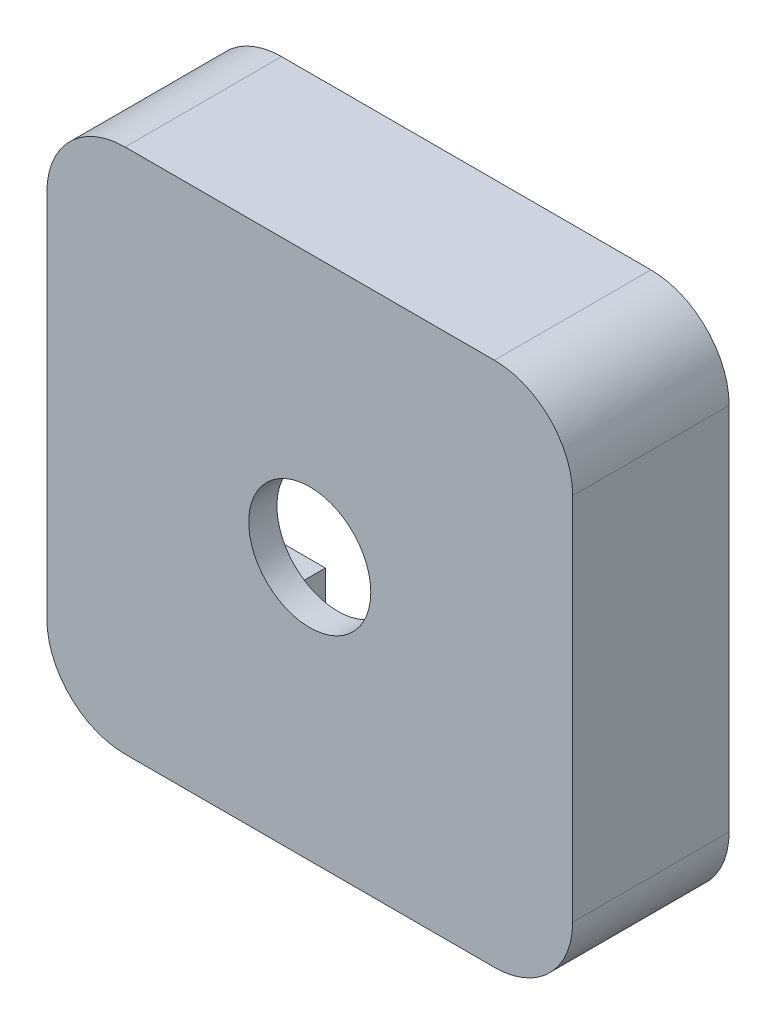
ISO-10303-21;
HEADER;
FILE_DESCRIPTION(('STEP AP214'),'2;1');
FILE_NAME('part.step','',(''),(''),'','','');
FILE_SCHEMA(('AUTOMOTIVE_DESIGN { 1 0 10303 214 1 1 1 1 }'));
ENDSEC;
DATA;
#1=APPLICATION_CONTEXT('core data for automotive mechanical design processes');
#2=APPLICATION_PROTOCOL_DEFINITION('international standard','automotive_design',2000,#1);
#3=PRODUCT_CONTEXT('',#1,'mechanical');
#4=PRODUCT('Part','Part','',(#3));
#5=PRODUCT_RELATED_PRODUCT_CATEGORY('part','',(#4));
#6=PRODUCT_DEFINITION_FORMATION('','',#4);
#7=PRODUCT_DEFINITION_CONTEXT('part definition',#1,'design');
#8=PRODUCT_DEFINITION('design','',#6,#7);
#9=PRODUCT_DEFINITION_SHAPE('','',#8);
#10=(LENGTH_UNIT() NAMED_UNIT(*) SI_UNIT(.MILLI.,.METRE.));
#11=(NAMED_UNIT(*) PLANE_ANGLE_UNIT() SI_UNIT($,.RADIAN.));
#12=(NAMED_UNIT(*) SI_UNIT($,.STERADIAN.) SOLID_ANGLE_UNIT());
#13=UNCERTAINTY_MEASURE_WITH_UNIT(LENGTH_MEASURE(1.E-05),#10,'distance_accuracy_value','');
#14=(GEOMETRIC_REPRESENTATION_CONTEXT(3) GLOBAL_UNCERTAINTY_ASSIGNED_CONTEXT((#13)) GLOBAL_UNIT_ASSIGNED_CONTEXT((#10,
#11,#12)) REPRESENTATION_CONTEXT('',''));
#15=CARTESIAN_POINT('',(0.,0.,0.));
#16=DIRECTION('',(0.,0.,1.));
#17=DIRECTION('',(1.,0.,0.));
#18=AXIS2_PLACEMENT_3D('',#15,#16,#17);
#19=CARTESIAN_POINT('',(0.,-12.4537560275611,-10.));
#20=DIRECTION('',(0.,-1.,0.));
#21=DIRECTION('',(1.,0.,0.));
#22=AXIS2_PLACEMENT_3D('',#19,#20,#21);
#23=PLANE('',#22);
#24=DIRECTION('',(0.,0.,-1.));
#25=VECTOR('',#24,1.);
#26=CARTESIAN_POINT('',(-9.72105263157896,-12.4537560275611,-6.2));
#27=LINE('',#26,#25);
#28=CARTESIAN_POINT('',(-9.72105263157896,-12.4537560275611,-6.2));
#29=VERTEX_POINT('',#28);
#30=CARTESIAN_POINT('',(-9.72105263157896,-12.4537560275611,-10.));
#31=VERTEX_POINT('',#30);
#32=EDGE_CURVE('E147',#29,#31,#27,.T.);
#33=ORIENTED_EDGE('',*,*,#32,.T.);
#34=DIRECTION('',(1.,0.,0.));
#35=VECTOR('',#34,1.);
#36=CARTESIAN_POINT('',(0.,-12.4537560275611,-10.));
#37=LINE('',#36,#35);
#38=CARTESIAN_POINT('',(-13.321052631579,-12.4537560275611,-10.));
#39=VERTEX_POINT('',#38);
#40=EDGE_CURVE('E203',#39,#31,#37,.T.);
#41=ORIENTED_EDGE('',*,*,#40,.F.);
#42=DIRECTION('',(0.,0.,1.));
#43=VECTOR('',#42,1.);
#44=CARTESIAN_POINT('',(-13.321052631579,-12.4537560275611,-10.));
#45=LINE('',#44,#43);
#46=CARTESIAN_POINT('',(-13.321052631579,-12.4537560275611,-1.8));
#47=VERTEX_POINT('',#46);
#48=EDGE_CURVE('E222',#39,#47,#45,.T.);
#49=ORIENTED_EDGE('',*,*,#48,.T.);
#50=DIRECTION('',(1.,0.,0.));
#51=VECTOR('',#50,1.);
#52=CARTESIAN_POINT('',(0.,-12.4537560275611,-1.8));
#53=LINE('',#52,#51);
#54=CARTESIAN_POINT('',(11.878947368421,-12.4537560275611,-1.8));
#55=VERTEX_POINT('',#54);
#56=EDGE_CURVE('E240',#47,#55,#53,.T.);
#57=ORIENTED_EDGE('',*,*,#56,.T.);
#58=DIRECTION('',(0.,0.,1.));
#59=VECTOR('',#58,1.);
#60=CARTESIAN_POINT('',(11.878947368421,-12.4537560275611,-10.));
#61=LINE('',#60,#59);
#62=CARTESIAN_POINT('',(11.878947368421,-12.4537560275611,-10.));
#63=VERTEX_POINT('',#62);
#64=EDGE_CURVE('E225',#63,#55,#61,.T.);
#65=ORIENTED_EDGE('',*,*,#64,.F.);
#66=CARTESIAN_POINT('',(8.27894736842104,-12.4537560275611,-10.));
#67=VERTEX_POINT('',#66);
#68=EDGE_CURVE('E202',#67,#63,#37,.T.);
#69=ORIENTED_EDGE('',*,*,#68,.F.);
#70=DIRECTION('',(0.,0.,-1.));
#71=VECTOR('',#70,1.);
#72=CARTESIAN_POINT('',(8.27894736842104,-12.4537560275611,-6.2));
#73=LINE('',#72,#71);
#74=CARTESIAN_POINT('',(8.27894736842104,-12.4537560275611,-6.2));
#75=VERTEX_POINT('',#74);
#76=EDGE_CURVE('E50',#75,#67,#73,.T.);
#77=ORIENTED_EDGE('',*,*,#76,.F.);
#78=DIRECTION('',(1.,0.,0.));
#79=VECTOR('',#78,1.);
#80=CARTESIAN_POINT('',(0.,-12.4537560275611,-6.2));
#81=LINE('',#80,#79);
#82=EDGE_CURVE('E163',#29,#75,#81,.T.);
#83=ORIENTED_EDGE('',*,*,#82,.F.);
#84=EDGE_LOOP('',(#33,#41,#49,#57,#65,#69,#77,#83));
#85=FACE_BOUND('',#84,.T.);
#86=ADVANCED_FACE('F35',(#85),#23,.F.);
#87=CARTESIAN_POINT('',(0.,-19.1537560275611,-10.));
#88=DIRECTION('',(0.,-1.,0.));
#89=DIRECTION('',(0.,0.,-1.));
#90=AXIS2_PLACEMENT_3D('',#87,#88,#89);
#91=PLANE('',#90);
#92=DIRECTION('',(1.,0.,0.));
#93=VECTOR('',#92,1.);
#94=CARTESIAN_POINT('',(0.,-19.1537560275611,-10.));
#95=LINE('',#94,#93);
#96=CARTESIAN_POINT('',(-12.521052631579,-19.1537560275611,-10.));
#97=VERTEX_POINT('',#96);
#98=CARTESIAN_POINT('',(-9.72105263157896,-19.1537560275611,-10.));
#99=VERTEX_POINT('',#98);
#100=EDGE_CURVE('E193',#97,#99,#95,.T.);
#101=ORIENTED_EDGE('',*,*,#100,.T.);
#102=DIRECTION('',(0.,0.,-1.));
#103=VECTOR('',#102,1.);
#104=CARTESIAN_POINT('',(-9.72105263157896,-19.1537560275611,-6.2));
#105=LINE('',#104,#103);
#106=CARTESIAN_POINT('',(-9.72105263157896,-19.1537560275611,-6.2));
#107=VERTEX_POINT('',#106);
#108=EDGE_CURVE('E176',#107,#99,#105,.T.);
#109=ORIENTED_EDGE('',*,*,#108,.F.);
#110=DIRECTION('',(-1.,0.,0.));
#111=VECTOR('',#110,1.);
#112=CARTESIAN_POINT('',(0.,-19.1537560275611,-6.2));
#113=LINE('',#112,#111);
#114=CARTESIAN_POINT('',(8.27894736842104,-19.1537560275611,-6.2));
#115=VERTEX_POINT('',#114);
#116=EDGE_CURVE('E157',#115,#107,#113,.T.);
#117=ORIENTED_EDGE('',*,*,#116,.F.);
#118=DIRECTION('',(0.,0.,-1.));
#119=VECTOR('',#118,1.);
#120=CARTESIAN_POINT('',(8.27894736842104,-19.1537560275611,-6.2));
#121=LINE('',#120,#119);
#122=CARTESIAN_POINT('',(8.27894736842104,-19.1537560275611,-10.));
#123=VERTEX_POINT('',#122);
#124=EDGE_CURVE('E179',#115,#123,#121,.T.);
#125=ORIENTED_EDGE('',*,*,#124,.T.);
#126=CARTESIAN_POINT('',(11.078947368421,-19.1537560275611,-10.));
#127=VERTEX_POINT('',#126);
#128=EDGE_CURVE('E192',#123,#127,#95,.T.);
#129=ORIENTED_EDGE('',*,*,#128,.T.);
#130=DIRECTION('',(0.,0.,1.));
#131=VECTOR('',#130,1.);
#132=CARTESIAN_POINT('',(11.078947368421,-19.1537560275611,0.));
#133=LINE('',#132,#131);
#134=CARTESIAN_POINT('',(11.078947368421,-19.1537560275611,0.));
#135=VERTEX_POINT('',#134);
#136=EDGE_CURVE('E258',#127,#135,#133,.T.);
#137=ORIENTED_EDGE('',*,*,#136,.T.);
#138=DIRECTION('',(1.,0.,0.));
#139=VECTOR('',#138,1.);
#140=CARTESIAN_POINT('',(0.,-19.1537560275611,0.));
#141=LINE('',#140,#139);
#142=CARTESIAN_POINT('',(-12.521052631579,-19.1537560275611,0.));
#143=VERTEX_POINT('',#142);
#144=EDGE_CURVE('E187',#143,#135,#141,.T.);
#145=ORIENTED_EDGE('',*,*,#144,.F.);
#146=DIRECTION('',(0.,0.,1.));
#147=VECTOR('',#146,1.);
#148=CARTESIAN_POINT('',(-12.521052631579,-19.1537560275611,-10.));
#149=LINE('',#148,#147);
#150=EDGE_CURVE('E261',#143,#97,#149,.F.);
#151=ORIENTED_EDGE('',*,*,#150,.T.);
#152=EDGE_LOOP('',(#101,#109,#117,#125,#129,#137,#145,#151));
#153=FACE_BOUND('',#152,.T.);
#154=ADVANCED_FACE('F303',(#153),#91,.T.);
#155=CARTESIAN_POINT('',(0.,0.,-10.));
#156=DIRECTION('',(0.,0.,1.));
#157=DIRECTION('',(1.,0.,0.));
#158=AXIS2_PLACEMENT_3D('',#155,#156,#157);
#159=PLANE('',#158);
#160=DIRECTION('',(0.,-1.,0.));
#161=VECTOR('',#160,1.);
#162=CARTESIAN_POINT('',(-9.72105263157896,0.,-10.));
#163=LINE('',#162,#161);
#164=EDGE_CURVE('E153',#31,#99,#163,.T.);
#165=ORIENTED_EDGE('',*,*,#164,.T.);
#166=ORIENTED_EDGE('',*,*,#100,.F.);
#167=CARTESIAN_POINT('',(-12.521052631579,-14.1537560275611,-10.));
#168=DIRECTION('',(0.,0.,1.));
#169=DIRECTION('',(1.,0.,0.));
#170=AXIS2_PLACEMENT_3D('',#167,#168,#169);
#171=CIRCLE('',#170,5.);
#172=CARTESIAN_POINT('',(-17.521052631579,-14.1537560275611,-10.));
#173=VERTEX_POINT('',#172);
#174=EDGE_CURVE('E270',#97,#173,#171,.F.);
#175=ORIENTED_EDGE('',*,*,#174,.T.);
#176=DIRECTION('',(0.,-1.,0.));
#177=VECTOR('',#176,1.);
#178=CARTESIAN_POINT('',(-17.521052631579,0.,-10.));
#179=LINE('',#178,#177);
#180=CARTESIAN_POINT('',(-17.521052631579,9.44624397243892,-10.));
#181=VERTEX_POINT('',#180);
#182=EDGE_CURVE('E189',#181,#173,#179,.T.);
#183=ORIENTED_EDGE('',*,*,#182,.F.);
#184=CARTESIAN_POINT('',(-12.521052631579,9.44624397243892,-10.));
#185=DIRECTION('',(0.,0.,1.));
#186=DIRECTION('',(1.,0.,0.));
#187=AXIS2_PLACEMENT_3D('',#184,#185,#186);
#188=CIRCLE('',#187,5.);
#189=CARTESIAN_POINT('',(-12.521052631579,14.4462439724389,-10.));
#190=VERTEX_POINT('',#189);
#191=EDGE_CURVE('E263',#181,#190,#188,.F.);
#192=ORIENTED_EDGE('',*,*,#191,.T.);
#193=DIRECTION('',(1.,0.,0.));
#194=VECTOR('',#193,1.);
#195=CARTESIAN_POINT('',(0.,14.4462439724389,-10.));
#196=LINE('',#195,#194);
#197=CARTESIAN_POINT('',(11.078947368421,14.4462439724389,-10.));
#198=VERTEX_POINT('',#197);
#199=EDGE_CURVE('E186',#190,#198,#196,.T.);
#200=ORIENTED_EDGE('',*,*,#199,.T.);
#201=CARTESIAN_POINT('',(11.078947368421,9.44624397243892,-10.));
#202=DIRECTION('',(0.,0.,1.));
#203=DIRECTION('',(1.,0.,0.));
#204=AXIS2_PLACEMENT_3D('',#201,#202,#203);
#205=CIRCLE('',#204,5.);
#206=CARTESIAN_POINT('',(16.078947368421,9.44624397243892,-10.));
#207=VERTEX_POINT('',#206);
#208=EDGE_CURVE('E265',#198,#207,#205,.F.);
#209=ORIENTED_EDGE('',*,*,#208,.T.);
#210=DIRECTION('',(0.,-1.,0.));
#211=VECTOR('',#210,1.);
#212=CARTESIAN_POINT('',(16.078947368421,0.,-10.));
#213=LINE('',#212,#211);
#214=CARTESIAN_POINT('',(16.078947368421,-14.1537560275611,-10.));
#215=VERTEX_POINT('',#214);
#216=EDGE_CURVE('E183',#207,#215,#213,.T.);
#217=ORIENTED_EDGE('',*,*,#216,.T.);
#218=CARTESIAN_POINT('',(11.078947368421,-14.1537560275611,-10.));
#219=DIRECTION('',(0.,0.,1.));
#220=DIRECTION('',(1.,0.,0.));
#221=AXIS2_PLACEMENT_3D('',#218,#219,#220);
#222=CIRCLE('',#221,5.);
#223=EDGE_CURVE('E267',#215,#127,#222,.F.);
#224=ORIENTED_EDGE('',*,*,#223,.T.);
#225=ORIENTED_EDGE('',*,*,#128,.F.);
#226=DIRECTION('',(0.,-1.,0.));
#227=VECTOR('',#226,1.);
#228=CARTESIAN_POINT('',(8.27894736842104,0.,-10.));
#229=LINE('',#228,#227);
#230=EDGE_CURVE('E166',#67,#123,#229,.T.);
#231=ORIENTED_EDGE('',*,*,#230,.F.);
#232=ORIENTED_EDGE('',*,*,#68,.T.);
#233=DIRECTION('',(0.,-1.,0.));
#234=VECTOR('',#233,1.);
#235=CARTESIAN_POINT('',(11.878947368421,0.,-10.));
#236=LINE('',#235,#234);
#237=CARTESIAN_POINT('',(11.878947368421,12.4462439724389,-10.));
#238=VERTEX_POINT('',#237);
#239=EDGE_CURVE('E199',#238,#63,#236,.T.);
#240=ORIENTED_EDGE('',*,*,#239,.F.);
#241=DIRECTION('',(1.,0.,0.));
#242=VECTOR('',#241,1.);
#243=CARTESIAN_POINT('',(0.,12.4462439724389,-10.));
#244=LINE('',#243,#242);
#245=CARTESIAN_POINT('',(-13.321052631579,12.4462439724389,-10.));
#246=VERTEX_POINT('',#245);
#247=EDGE_CURVE('E196',#246,#238,#244,.T.);
#248=ORIENTED_EDGE('',*,*,#247,.F.);
#249=DIRECTION('',(0.,-1.,0.));
#250=VECTOR('',#249,1.);
#251=CARTESIAN_POINT('',(-13.321052631579,0.,-10.));
#252=LINE('',#251,#250);
#253=EDGE_CURVE('E205',#246,#39,#252,.T.);
#254=ORIENTED_EDGE('',*,*,#253,.T.);
#255=ORIENTED_EDGE('',*,*,#40,.T.);
#256=EDGE_LOOP('',(#165,#166,#175,#183,#192,#200,#209,#217,#224,#225,#231,#232,#240,#248,#254,#255));
#257=FACE_BOUND('',#256,.T.);
#258=ADVANCED_FACE('F296',(#257),#159,.F.);
#259=CARTESIAN_POINT('',(-0.721052631578959,-2.35375602756108,-1.8));
#260=DIRECTION('',(0.,0.,1.));
#261=DIRECTION('',(1.,0.,0.));
#262=AXIS2_PLACEMENT_3D('',#259,#260,#261);
#263=CYLINDRICAL_SURFACE('',#262,3.9);
#264=CARTESIAN_POINT('',(-0.721052631578959,-2.35375602756108,-1.8));
#265=DIRECTION('',(0.,0.,1.));
#266=DIRECTION('',(1.,0.,0.));
#267=AXIS2_PLACEMENT_3D('',#264,#265,#266);
#268=CIRCLE('',#267,3.9);
#269=CARTESIAN_POINT('',(3.17894736842104,-2.35375602756108,-1.8));
#270=VERTEX_POINT('',#269);
#271=EDGE_CURVE('E229',#270,#270,#268,.T.);
#272=ORIENTED_EDGE('',*,*,#271,.F.);
#273=EDGE_LOOP('',(#272));
#274=FACE_BOUND('',#273,.T.);
#275=CARTESIAN_POINT('',(-0.721052631578959,-2.35375602756108,0.));
#276=DIRECTION('',(0.,0.,1.));
#277=DIRECTION('',(1.,0.,0.));
#278=AXIS2_PLACEMENT_3D('',#275,#276,#277);
#279=CIRCLE('',#278,3.9);
#280=CARTESIAN_POINT('',(3.17894736842104,-2.35375602756108,0.));
#281=VERTEX_POINT('',#280);
#282=EDGE_CURVE('E221',#281,#281,#279,.T.);
#283=ORIENTED_EDGE('',*,*,#282,.T.);
#284=EDGE_LOOP('',(#283));
#285=FACE_BOUND('',#284,.T.);
#286=ADVANCED_FACE('F348',(#274,#285),#263,.F.);
#287=CARTESIAN_POINT('',(0.,0.,-1.8));
#288=DIRECTION('',(0.,0.,1.));
#289=DIRECTION('',(1.,0.,0.));
#290=AXIS2_PLACEMENT_3D('',#287,#288,#289);
#291=PLANE('',#290);
#292=ORIENTED_EDGE('',*,*,#271,.T.);
#293=EDGE_LOOP('',(#292));
#294=FACE_BOUND('',#293,.T.);
#295=DIRECTION('',(0.,-1.,0.));
#296=VECTOR('',#295,1.);
#297=CARTESIAN_POINT('',(11.878947368421,0.,-1.8));
#298=LINE('',#297,#296);
#299=CARTESIAN_POINT('',(11.878947368421,12.4462439724389,-1.8));
#300=VERTEX_POINT('',#299);
#301=EDGE_CURVE('E232',#300,#55,#298,.T.);
#302=ORIENTED_EDGE('',*,*,#301,.T.);
#303=ORIENTED_EDGE('',*,*,#56,.F.);
#304=DIRECTION('',(0.,-1.,0.));
#305=VECTOR('',#304,1.);
#306=CARTESIAN_POINT('',(-13.321052631579,0.,-1.8));
#307=LINE('',#306,#305);
#308=CARTESIAN_POINT('',(-13.321052631579,12.4462439724389,-1.8));
#309=VERTEX_POINT('',#308);
#310=EDGE_CURVE('E238',#309,#47,#307,.T.);
#311=ORIENTED_EDGE('',*,*,#310,.F.);
#312=DIRECTION('',(1.,0.,0.));
#313=VECTOR('',#312,1.);
#314=CARTESIAN_POINT('',(0.,12.4462439724389,-1.8));
#315=LINE('',#314,#313);
#316=EDGE_CURVE('E235',#309,#300,#315,.T.);
#317=ORIENTED_EDGE('',*,*,#316,.T.);
#318=EDGE_LOOP('',(#302,#303,#311,#317));
#319=FACE_BOUND('',#318,.T.);
#320=ADVANCED_FACE('F345',(#294,#319),#291,.F.);
#321=CARTESIAN_POINT('',(0.,0.,0.));
#322=DIRECTION('',(0.,0.,1.));
#323=DIRECTION('',(1.,0.,0.));
#324=AXIS2_PLACEMENT_3D('',#321,#322,#323);
#325=PLANE('',#324);
#326=ORIENTED_EDGE('',*,*,#282,.F.);
#327=EDGE_LOOP('',(#326));
#328=FACE_BOUND('',#327,.T.);
#329=DIRECTION('',(0.,-1.,0.));
#330=VECTOR('',#329,1.);
#331=CARTESIAN_POINT('',(-17.521052631579,0.,0.));
#332=LINE('',#331,#330);
#333=CARTESIAN_POINT('',(-17.521052631579,9.44624397243892,0.));
#334=VERTEX_POINT('',#333);
#335=CARTESIAN_POINT('',(-17.521052631579,-14.1537560275611,0.));
#336=VERTEX_POINT('',#335);
#337=EDGE_CURVE('E213',#334,#336,#332,.T.);
#338=ORIENTED_EDGE('',*,*,#337,.T.);
#339=CARTESIAN_POINT('',(-12.521052631579,-14.1537560275611,0.));
#340=DIRECTION('',(0.,0.,1.));
#341=DIRECTION('',(1.,0.,0.));
#342=AXIS2_PLACEMENT_3D('',#339,#340,#341);
#343=CIRCLE('',#342,5.);
#344=EDGE_CURVE('E256',#336,#143,#343,.T.);
#345=ORIENTED_EDGE('',*,*,#344,.T.);
#346=ORIENTED_EDGE('',*,*,#144,.T.);
#347=CARTESIAN_POINT('',(11.078947368421,-14.1537560275611,0.));
#348=DIRECTION('',(0.,0.,1.));
#349=DIRECTION('',(1.,0.,0.));
#350=AXIS2_PLACEMENT_3D('',#347,#348,#349);
#351=CIRCLE('',#350,5.);
#352=CARTESIAN_POINT('',(16.078947368421,-14.1537560275611,0.));
#353=VERTEX_POINT('',#352);
#354=EDGE_CURVE('E254',#135,#353,#351,.T.);
#355=ORIENTED_EDGE('',*,*,#354,.T.);
#356=DIRECTION('',(0.,-1.,0.));
#357=VECTOR('',#356,1.);
#358=CARTESIAN_POINT('',(16.078947368421,0.,0.));
#359=LINE('',#358,#357);
#360=CARTESIAN_POINT('',(16.078947368421,9.44624397243892,0.));
#361=VERTEX_POINT('',#360);
#362=EDGE_CURVE('E178',#361,#353,#359,.T.);
#363=ORIENTED_EDGE('',*,*,#362,.F.);
#364=CARTESIAN_POINT('',(11.078947368421,9.44624397243892,0.));
#365=DIRECTION('',(0.,0.,1.));
#366=DIRECTION('',(1.,0.,0.));
#367=AXIS2_PLACEMENT_3D('',#364,#365,#366);
#368=CIRCLE('',#367,5.);
#369=CARTESIAN_POINT('',(11.078947368421,14.4462439724389,0.));
#370=VERTEX_POINT('',#369);
#371=EDGE_CURVE('E252',#361,#370,#368,.T.);
#372=ORIENTED_EDGE('',*,*,#371,.T.);
#373=DIRECTION('',(1.,0.,0.));
#374=VECTOR('',#373,1.);
#375=CARTESIAN_POINT('',(0.,14.4462439724389,0.));
#376=LINE('',#375,#374);
#377=CARTESIAN_POINT('',(-12.521052631579,14.4462439724389,0.));
#378=VERTEX_POINT('',#377);
#379=EDGE_CURVE('E211',#378,#370,#376,.T.);
#380=ORIENTED_EDGE('',*,*,#379,.F.);
#381=CARTESIAN_POINT('',(-12.521052631579,9.44624397243892,0.));
#382=DIRECTION('',(0.,0.,1.));
#383=DIRECTION('',(1.,0.,0.));
#384=AXIS2_PLACEMENT_3D('',#381,#382,#383);
#385=CIRCLE('',#384,5.);
#386=EDGE_CURVE('E250',#378,#334,#385,.T.);
#387=ORIENTED_EDGE('',*,*,#386,.T.);
#388=EDGE_LOOP('',(#338,#345,#346,#355,#363,#372,#380,#387));
#389=FACE_BOUND('',#388,.T.);
#390=ADVANCED_FACE('F283',(#328,#389),#325,.T.);
#391=CARTESIAN_POINT('',(0.,12.4462439724389,-10.));
#392=DIRECTION('',(0.,-1.,0.));
#393=DIRECTION('',(0.,0.,-1.));
#394=AXIS2_PLACEMENT_3D('',#391,#392,#393);
#395=PLANE('',#394);
#396=ORIENTED_EDGE('',*,*,#316,.F.);
#397=DIRECTION('',(0.,0.,1.));
#398=VECTOR('',#397,1.);
#399=CARTESIAN_POINT('',(-13.321052631579,12.4462439724389,-10.));
#400=LINE('',#399,#398);
#401=EDGE_CURVE('E218',#246,#309,#400,.T.);
#402=ORIENTED_EDGE('',*,*,#401,.F.);
#403=ORIENTED_EDGE('',*,*,#247,.T.);
#404=DIRECTION('',(0.,0.,1.));
#405=VECTOR('',#404,1.);
#406=CARTESIAN_POINT('',(11.878947368421,12.4462439724389,-10.));
#407=LINE('',#406,#405);
#408=EDGE_CURVE('E208',#238,#300,#407,.T.);
#409=ORIENTED_EDGE('',*,*,#408,.T.);
#410=EDGE_LOOP('',(#396,#402,#403,#409));
#411=FACE_BOUND('',#410,.T.);
#412=ADVANCED_FACE('F335',(#411),#395,.T.);
#413=CARTESIAN_POINT('',(-13.321052631579,0.,-10.));
#414=DIRECTION('',(-1.,0.,0.));
#415=DIRECTION('',(0.,-1.,0.));
#416=AXIS2_PLACEMENT_3D('',#413,#414,#415);
#417=PLANE('',#416);
#418=ORIENTED_EDGE('',*,*,#401,.T.);
#419=ORIENTED_EDGE('',*,*,#310,.T.);
#420=ORIENTED_EDGE('',*,*,#48,.F.);
#421=ORIENTED_EDGE('',*,*,#253,.F.);
#422=EDGE_LOOP('',(#418,#419,#420,#421));
#423=FACE_BOUND('',#422,.T.);
#424=ADVANCED_FACE('F329',(#423),#417,.F.);
#425=CARTESIAN_POINT('',(11.878947368421,0.,-10.));
#426=DIRECTION('',(-1.,0.,0.));
#427=DIRECTION('',(0.,-1.,0.));
#428=AXIS2_PLACEMENT_3D('',#425,#426,#427);
#429=PLANE('',#428);
#430=ORIENTED_EDGE('',*,*,#301,.F.);
#431=ORIENTED_EDGE('',*,*,#408,.F.);
#432=ORIENTED_EDGE('',*,*,#239,.T.);
#433=ORIENTED_EDGE('',*,*,#64,.T.);
#434=EDGE_LOOP('',(#430,#431,#432,#433));
#435=FACE_BOUND('',#434,.T.);
#436=ADVANCED_FACE('F331',(#435),#429,.T.);
#437=CARTESIAN_POINT('',(16.078947368421,0.,-10.));
#438=DIRECTION('',(-1.,0.,0.));
#439=DIRECTION('',(0.,-1.,0.));
#440=AXIS2_PLACEMENT_3D('',#437,#438,#439);
#441=PLANE('',#440);
#442=ORIENTED_EDGE('',*,*,#362,.T.);
#443=DIRECTION('',(0.,0.,1.));
#444=VECTOR('',#443,1.);
#445=CARTESIAN_POINT('',(16.078947368421,-14.1537560275611,-10.));
#446=LINE('',#445,#444);
#447=EDGE_CURVE('E275',#353,#215,#446,.F.);
#448=ORIENTED_EDGE('',*,*,#447,.T.);
#449=ORIENTED_EDGE('',*,*,#216,.F.);
#450=DIRECTION('',(0.,0.,1.));
#451=VECTOR('',#450,1.);
#452=CARTESIAN_POINT('',(16.078947368421,9.44624397243892,-10.));
#453=LINE('',#452,#451);
#454=EDGE_CURVE('E272',#207,#361,#453,.T.);
#455=ORIENTED_EDGE('',*,*,#454,.T.);
#456=EDGE_LOOP('',(#442,#448,#449,#455));
#457=FACE_BOUND('',#456,.T.);
#458=ADVANCED_FACE('F292',(#457),#441,.F.);
#459=CARTESIAN_POINT('',(-17.521052631579,0.,-10.));
#460=DIRECTION('',(-1.,0.,0.));
#461=DIRECTION('',(0.,-1.,0.));
#462=AXIS2_PLACEMENT_3D('',#459,#460,#461);
#463=PLANE('',#462);
#464=ORIENTED_EDGE('',*,*,#182,.T.);
#465=DIRECTION('',(0.,0.,1.));
#466=VECTOR('',#465,1.);
#467=CARTESIAN_POINT('',(-17.521052631579,-14.1537560275611,-10.));
#468=LINE('',#467,#466);
#469=EDGE_CURVE('E247',#173,#336,#468,.T.);
#470=ORIENTED_EDGE('',*,*,#469,.T.);
#471=ORIENTED_EDGE('',*,*,#337,.F.);
#472=DIRECTION('',(0.,0.,1.));
#473=VECTOR('',#472,1.);
#474=CARTESIAN_POINT('',(-17.521052631579,9.44624397243892,-10.));
#475=LINE('',#474,#473);
#476=EDGE_CURVE('E243',#334,#181,#475,.F.);
#477=ORIENTED_EDGE('',*,*,#476,.T.);
#478=EDGE_LOOP('',(#464,#470,#471,#477));
#479=FACE_BOUND('',#478,.T.);
#480=ADVANCED_FACE('F310',(#479),#463,.T.);
#481=CARTESIAN_POINT('',(0.,14.4462439724389,-10.));
#482=DIRECTION('',(0.,-1.,0.));
#483=DIRECTION('',(0.,0.,-1.));
#484=AXIS2_PLACEMENT_3D('',#481,#482,#483);
#485=PLANE('',#484);
#486=ORIENTED_EDGE('',*,*,#379,.T.);
#487=DIRECTION('',(0.,0.,1.));
#488=VECTOR('',#487,1.);
#489=CARTESIAN_POINT('',(11.078947368421,14.4462439724389,-10.));
#490=LINE('',#489,#488);
#491=EDGE_CURVE('E11',#370,#198,#490,.F.);
#492=ORIENTED_EDGE('',*,*,#491,.T.);
#493=ORIENTED_EDGE('',*,*,#199,.F.);
#494=DIRECTION('',(0.,0.,1.));
#495=VECTOR('',#494,1.);
#496=CARTESIAN_POINT('',(-12.521052631579,14.4462439724389,0.));
#497=LINE('',#496,#495);
#498=EDGE_CURVE('E43',#190,#378,#497,.T.);
#499=ORIENTED_EDGE('',*,*,#498,.T.);
#500=EDGE_LOOP('',(#486,#492,#493,#499));
#501=FACE_BOUND('',#500,.T.);
#502=ADVANCED_FACE('F279',(#501),#485,.F.);
#503=CARTESIAN_POINT('',(-12.521052631579,-14.1537560275611,-10.));
#504=DIRECTION('',(0.,0.,1.));
#505=DIRECTION('',(1.,0.,0.));
#506=AXIS2_PLACEMENT_3D('',#503,#504,#505);
#507=CYLINDRICAL_SURFACE('',#506,5.);
#508=ORIENTED_EDGE('',*,*,#174,.F.);
#509=ORIENTED_EDGE('',*,*,#150,.F.);
#510=ORIENTED_EDGE('',*,*,#344,.F.);
#511=ORIENTED_EDGE('',*,*,#469,.F.);
#512=EDGE_LOOP('',(#508,#509,#510,#511));
#513=FACE_BOUND('',#512,.T.);
#514=ADVANCED_FACE('F308',(#513),#507,.T.);
#515=CARTESIAN_POINT('',(11.078947368421,-14.1537560275611,-10.));
#516=DIRECTION('',(0.,0.,-1.));
#517=DIRECTION('',(-1.,0.,0.));
#518=AXIS2_PLACEMENT_3D('',#515,#516,#517);
#519=CYLINDRICAL_SURFACE('',#518,5.);
#520=ORIENTED_EDGE('',*,*,#223,.F.);
#521=ORIENTED_EDGE('',*,*,#447,.F.);
#522=ORIENTED_EDGE('',*,*,#354,.F.);
#523=ORIENTED_EDGE('',*,*,#136,.F.);
#524=EDGE_LOOP('',(#520,#521,#522,#523));
#525=FACE_BOUND('',#524,.T.);
#526=ADVANCED_FACE('F300',(#525),#519,.T.);
#527=CARTESIAN_POINT('',(11.078947368421,9.44624397243892,-10.));
#528=DIRECTION('',(0.,0.,1.));
#529=DIRECTION('',(1.,0.,0.));
#530=AXIS2_PLACEMENT_3D('',#527,#528,#529);
#531=CYLINDRICAL_SURFACE('',#530,5.);
#532=ORIENTED_EDGE('',*,*,#208,.F.);
#533=ORIENTED_EDGE('',*,*,#491,.F.);
#534=ORIENTED_EDGE('',*,*,#371,.F.);
#535=ORIENTED_EDGE('',*,*,#454,.F.);
#536=EDGE_LOOP('',(#532,#533,#534,#535));
#537=FACE_BOUND('',#536,.T.);
#538=ADVANCED_FACE('F289',(#537),#531,.T.);
#539=CARTESIAN_POINT('',(-12.521052631579,9.44624397243892,-10.));
#540=DIRECTION('',(0.,0.,-1.));
#541=DIRECTION('',(-1.,0.,0.));
#542=AXIS2_PLACEMENT_3D('',#539,#540,#541);
#543=CYLINDRICAL_SURFACE('',#542,5.);
#544=ORIENTED_EDGE('',*,*,#191,.F.);
#545=ORIENTED_EDGE('',*,*,#476,.F.);
#546=ORIENTED_EDGE('',*,*,#386,.F.);
#547=ORIENTED_EDGE('',*,*,#498,.F.);
#548=EDGE_LOOP('',(#544,#545,#546,#547));
#549=FACE_BOUND('',#548,.T.);
#550=ADVANCED_FACE('F37',(#549),#543,.T.);
#551=CARTESIAN_POINT('',(-9.72105263157896,0.,-6.2));
#552=DIRECTION('',(1.,0.,0.));
#553=DIRECTION('',(0.,1.,0.));
#554=AXIS2_PLACEMENT_3D('',#551,#552,#553);
#555=PLANE('',#554);
#556=ORIENTED_EDGE('',*,*,#164,.F.);
#557=ORIENTED_EDGE('',*,*,#32,.F.);
#558=DIRECTION('',(0.,-1.,0.));
#559=VECTOR('',#558,1.);
#560=CARTESIAN_POINT('',(-9.72105263157896,0.,-6.2));
#561=LINE('',#560,#559);
#562=EDGE_CURVE('E150',#29,#107,#561,.T.);
#563=ORIENTED_EDGE('',*,*,#562,.T.);
#564=ORIENTED_EDGE('',*,*,#108,.T.);
#565=EDGE_LOOP('',(#556,#557,#563,#564));
#566=FACE_BOUND('',#565,.T.);
#567=ADVANCED_FACE('F149',(#566),#555,.T.);
#568=CARTESIAN_POINT('',(8.27894736842104,0.,-6.2));
#569=DIRECTION('',(1.,0.,0.));
#570=DIRECTION('',(0.,0.,-1.));
#571=AXIS2_PLACEMENT_3D('',#568,#569,#570);
#572=PLANE('',#571);
#573=ORIENTED_EDGE('',*,*,#230,.T.);
#574=ORIENTED_EDGE('',*,*,#124,.F.);
#575=DIRECTION('',(0.,-1.,0.));
#576=VECTOR('',#575,1.);
#577=CARTESIAN_POINT('',(8.27894736842104,0.,-6.2));
#578=LINE('',#577,#576);
#579=EDGE_CURVE('E169',#75,#115,#578,.T.);
#580=ORIENTED_EDGE('',*,*,#579,.F.);
#581=ORIENTED_EDGE('',*,*,#76,.T.);
#582=EDGE_LOOP('',(#573,#574,#580,#581));
#583=FACE_BOUND('',#582,.T.);
#584=ADVANCED_FACE('F319',(#583),#572,.F.);
#585=CARTESIAN_POINT('',(0.,0.,-6.2));
#586=DIRECTION('',(0.,0.,-1.));
#587=DIRECTION('',(-1.,0.,0.));
#588=AXIS2_PLACEMENT_3D('',#585,#586,#587);
#589=PLANE('',#588);
#590=ORIENTED_EDGE('',*,*,#562,.F.);
#591=ORIENTED_EDGE('',*,*,#82,.T.);
#592=ORIENTED_EDGE('',*,*,#579,.T.);
#593=ORIENTED_EDGE('',*,*,#116,.T.);
#594=EDGE_LOOP('',(#590,#591,#592,#593));
#595=FACE_BOUND('',#594,.T.);
#596=ADVANCED_FACE('F161',(#595),#589,.T.);
#597=CLOSED_SHELL('',(#86,#154,#258,#286,#320,#390,#412,#424,#436,#458,#480,#502,#514,#526,#538,
#550,#567,#584,#596));
#598=MANIFOLD_SOLID_BREP('B2',#597);
#599=ADVANCED_BREP_SHAPE_REPRESENTATION('',(#18,#598),#14);
#600=SHAPE_DEFINITION_REPRESENTATION(#9,#599);
ENDSEC;
END-ISO-10303-21;
